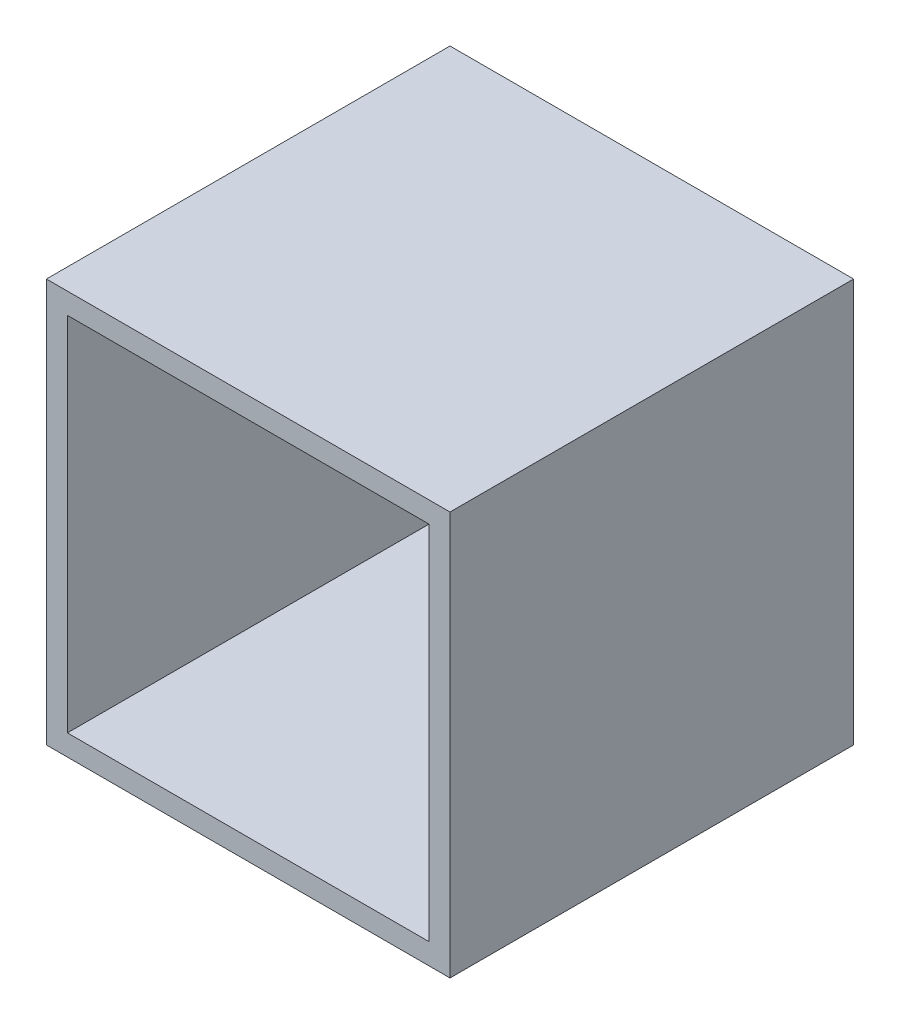
ISO-10303-21;
HEADER;
FILE_DESCRIPTION(('STEP AP214'),'2;1');
FILE_NAME('part.step','',(''),(''),'','','');
FILE_SCHEMA(('AUTOMOTIVE_DESIGN { 1 0 10303 214 1 1 1 1 }'));
ENDSEC;
DATA;
#1=APPLICATION_CONTEXT('core data for automotive mechanical design processes');
#2=APPLICATION_PROTOCOL_DEFINITION('international standard','automotive_design',2000,#1);
#3=PRODUCT_CONTEXT('',#1,'mechanical');
#4=PRODUCT('Part','Part','',(#3));
#5=PRODUCT_RELATED_PRODUCT_CATEGORY('part','',(#4));
#6=PRODUCT_DEFINITION_FORMATION('','',#4);
#7=PRODUCT_DEFINITION_CONTEXT('part definition',#1,'design');
#8=PRODUCT_DEFINITION('design','',#6,#7);
#9=PRODUCT_DEFINITION_SHAPE('','',#8);
#10=(LENGTH_UNIT() NAMED_UNIT(*) SI_UNIT(.MILLI.,.METRE.));
#11=(NAMED_UNIT(*) PLANE_ANGLE_UNIT() SI_UNIT($,.RADIAN.));
#12=(NAMED_UNIT(*) SI_UNIT($,.STERADIAN.) SOLID_ANGLE_UNIT());
#13=UNCERTAINTY_MEASURE_WITH_UNIT(LENGTH_MEASURE(1.E-05),#10,'distance_accuracy_value','');
#14=(GEOMETRIC_REPRESENTATION_CONTEXT(3) GLOBAL_UNCERTAINTY_ASSIGNED_CONTEXT((#13)) GLOBAL_UNIT_ASSIGNED_CONTEXT((#10,
#11,#12)) REPRESENTATION_CONTEXT('',''));
#15=CARTESIAN_POINT('',(0.,0.,0.));
#16=DIRECTION('',(0.,0.,1.));
#17=DIRECTION('',(1.,0.,0.));
#18=AXIS2_PLACEMENT_3D('',#15,#16,#17);
#19=CARTESIAN_POINT('',(0.,0.,63.5));
#20=DIRECTION('',(0.,0.,-1.));
#21=DIRECTION('',(-1.,0.,0.));
#22=AXIS2_PLACEMENT_3D('',#19,#20,#21);
#23=PLANE('',#22);
#24=DIRECTION('',(0.,1.,0.));
#25=VECTOR('',#24,1.);
#26=CARTESIAN_POINT('',(31.75,-31.75,63.5));
#27=LINE('',#26,#25);
#28=CARTESIAN_POINT('',(31.75,-31.75,63.5));
#29=VERTEX_POINT('',#28);
#30=CARTESIAN_POINT('',(31.75,31.75,63.5));
#31=VERTEX_POINT('',#30);
#32=EDGE_CURVE('E168',#29,#31,#27,.T.);
#33=ORIENTED_EDGE('',*,*,#32,.T.);
#34=DIRECTION('',(-1.,0.,0.));
#35=VECTOR('',#34,1.);
#36=CARTESIAN_POINT('',(-31.75,31.75,63.5));
#37=LINE('',#36,#35);
#38=CARTESIAN_POINT('',(-31.75,31.75,63.5));
#39=VERTEX_POINT('',#38);
#40=EDGE_CURVE('E172',#31,#39,#37,.T.);
#41=ORIENTED_EDGE('',*,*,#40,.T.);
#42=DIRECTION('',(0.,-1.,0.));
#43=VECTOR('',#42,1.);
#44=CARTESIAN_POINT('',(-31.75,-31.75,63.5));
#45=LINE('',#44,#43);
#46=CARTESIAN_POINT('',(-31.75,-31.75,63.5));
#47=VERTEX_POINT('',#46);
#48=EDGE_CURVE('E176',#39,#47,#45,.T.);
#49=ORIENTED_EDGE('',*,*,#48,.T.);
#50=DIRECTION('',(1.,0.,0.));
#51=VECTOR('',#50,1.);
#52=CARTESIAN_POINT('',(-31.75,-31.75,63.5));
#53=LINE('',#52,#51);
#54=EDGE_CURVE('E179',#47,#29,#53,.T.);
#55=ORIENTED_EDGE('',*,*,#54,.T.);
#56=EDGE_LOOP('',(#33,#41,#49,#55));
#57=FACE_BOUND('',#56,.T.);
#58=DIRECTION('',(0.,1.,0.));
#59=VECTOR('',#58,1.);
#60=CARTESIAN_POINT('',(28.448,-28.448,63.5));
#61=LINE('',#60,#59);
#62=CARTESIAN_POINT('',(28.448,-28.448,63.5));
#63=VERTEX_POINT('',#62);
#64=CARTESIAN_POINT('',(28.448,28.448,63.5));
#65=VERTEX_POINT('',#64);
#66=EDGE_CURVE('E120',#63,#65,#61,.T.);
#67=ORIENTED_EDGE('',*,*,#66,.F.);
#68=DIRECTION('',(1.,0.,0.));
#69=VECTOR('',#68,1.);
#70=CARTESIAN_POINT('',(-28.448,-28.448,63.5));
#71=LINE('',#70,#69);
#72=CARTESIAN_POINT('',(-28.448,-28.448,63.5));
#73=VERTEX_POINT('',#72);
#74=EDGE_CURVE('E146',#73,#63,#71,.T.);
#75=ORIENTED_EDGE('',*,*,#74,.F.);
#76=DIRECTION('',(0.,-1.,0.));
#77=VECTOR('',#76,1.);
#78=CARTESIAN_POINT('',(-28.448,-28.448,63.5));
#79=LINE('',#78,#77);
#80=CARTESIAN_POINT('',(-28.448,28.448,63.5));
#81=VERTEX_POINT('',#80);
#82=EDGE_CURVE('E142',#81,#73,#79,.T.);
#83=ORIENTED_EDGE('',*,*,#82,.F.);
#84=DIRECTION('',(-1.,0.,0.));
#85=VECTOR('',#84,1.);
#86=CARTESIAN_POINT('',(-28.448,28.448,63.5));
#87=LINE('',#86,#85);
#88=EDGE_CURVE('E129',#65,#81,#87,.T.);
#89=ORIENTED_EDGE('',*,*,#88,.F.);
#90=EDGE_LOOP('',(#67,#75,#83,#89));
#91=FACE_BOUND('',#90,.T.);
#92=ADVANCED_FACE('F54',(#57,#91),#23,.F.);
#93=CARTESIAN_POINT('',(0.,0.,0.));
#94=DIRECTION('',(0.,0.,-1.));
#95=DIRECTION('',(-1.,0.,0.));
#96=AXIS2_PLACEMENT_3D('',#93,#94,#95);
#97=PLANE('',#96);
#98=DIRECTION('',(0.,1.,0.));
#99=VECTOR('',#98,1.);
#100=CARTESIAN_POINT('',(31.75,-31.75,0.));
#101=LINE('',#100,#99);
#102=CARTESIAN_POINT('',(31.75,-31.75,0.));
#103=VERTEX_POINT('',#102);
#104=CARTESIAN_POINT('',(31.75,31.75,0.));
#105=VERTEX_POINT('',#104);
#106=EDGE_CURVE('E138',#103,#105,#101,.T.);
#107=ORIENTED_EDGE('',*,*,#106,.F.);
#108=DIRECTION('',(1.,0.,0.));
#109=VECTOR('',#108,1.);
#110=CARTESIAN_POINT('',(-31.75,-31.75,0.));
#111=LINE('',#110,#109);
#112=CARTESIAN_POINT('',(-31.75,-31.75,0.));
#113=VERTEX_POINT('',#112);
#114=EDGE_CURVE('E173',#113,#103,#111,.T.);
#115=ORIENTED_EDGE('',*,*,#114,.F.);
#116=DIRECTION('',(0.,-1.,0.));
#117=VECTOR('',#116,1.);
#118=CARTESIAN_POINT('',(-31.75,-31.75,0.));
#119=LINE('',#118,#117);
#120=CARTESIAN_POINT('',(-31.75,31.75,0.));
#121=VERTEX_POINT('',#120);
#122=EDGE_CURVE('E189',#121,#113,#119,.T.);
#123=ORIENTED_EDGE('',*,*,#122,.F.);
#124=DIRECTION('',(-1.,0.,0.));
#125=VECTOR('',#124,1.);
#126=CARTESIAN_POINT('',(-31.75,31.75,0.));
#127=LINE('',#126,#125);
#128=EDGE_CURVE('E186',#105,#121,#127,.T.);
#129=ORIENTED_EDGE('',*,*,#128,.F.);
#130=EDGE_LOOP('',(#107,#115,#123,#129));
#131=FACE_BOUND('',#130,.T.);
#132=DIRECTION('',(1.,0.,0.));
#133=VECTOR('',#132,1.);
#134=CARTESIAN_POINT('',(-28.448,-28.448,0.));
#135=LINE('',#134,#133);
#136=CARTESIAN_POINT('',(-28.448,-28.448,0.));
#137=VERTEX_POINT('',#136);
#138=CARTESIAN_POINT('',(28.448,-28.448,0.));
#139=VERTEX_POINT('',#138);
#140=EDGE_CURVE('E130',#137,#139,#135,.T.);
#141=ORIENTED_EDGE('',*,*,#140,.T.);
#142=DIRECTION('',(0.,1.,0.));
#143=VECTOR('',#142,1.);
#144=CARTESIAN_POINT('',(28.448,-28.448,0.));
#145=LINE('',#144,#143);
#146=CARTESIAN_POINT('',(28.448,28.448,0.));
#147=VERTEX_POINT('',#146);
#148=EDGE_CURVE('E78',#139,#147,#145,.T.);
#149=ORIENTED_EDGE('',*,*,#148,.T.);
#150=DIRECTION('',(-1.,0.,0.));
#151=VECTOR('',#150,1.);
#152=CARTESIAN_POINT('',(-28.448,28.448,0.));
#153=LINE('',#152,#151);
#154=CARTESIAN_POINT('',(-28.448,28.448,0.));
#155=VERTEX_POINT('',#154);
#156=EDGE_CURVE('E136',#147,#155,#153,.T.);
#157=ORIENTED_EDGE('',*,*,#156,.T.);
#158=DIRECTION('',(0.,-1.,0.));
#159=VECTOR('',#158,1.);
#160=CARTESIAN_POINT('',(-28.448,-28.448,0.));
#161=LINE('',#160,#159);
#162=EDGE_CURVE('E155',#155,#137,#161,.T.);
#163=ORIENTED_EDGE('',*,*,#162,.T.);
#164=EDGE_LOOP('',(#141,#149,#157,#163));
#165=FACE_BOUND('',#164,.T.);
#166=ADVANCED_FACE('F212',(#131,#165),#97,.T.);
#167=CARTESIAN_POINT('',(31.75,-31.75,63.5));
#168=DIRECTION('',(-1.,0.,0.));
#169=DIRECTION('',(0.,0.,1.));
#170=AXIS2_PLACEMENT_3D('',#167,#168,#169);
#171=PLANE('',#170);
#172=ORIENTED_EDGE('',*,*,#106,.T.);
#173=DIRECTION('',(0.,0.,-1.));
#174=VECTOR('',#173,1.);
#175=CARTESIAN_POINT('',(31.75,31.75,63.5));
#176=LINE('',#175,#174);
#177=EDGE_CURVE('E12',#31,#105,#176,.T.);
#178=ORIENTED_EDGE('',*,*,#177,.F.);
#179=ORIENTED_EDGE('',*,*,#32,.F.);
#180=DIRECTION('',(0.,0.,-1.));
#181=VECTOR('',#180,1.);
#182=CARTESIAN_POINT('',(31.75,-31.75,63.5));
#183=LINE('',#182,#181);
#184=EDGE_CURVE('E182',#29,#103,#183,.T.);
#185=ORIENTED_EDGE('',*,*,#184,.T.);
#186=EDGE_LOOP('',(#172,#178,#179,#185));
#187=FACE_BOUND('',#186,.T.);
#188=ADVANCED_FACE('F56',(#187),#171,.F.);
#189=CARTESIAN_POINT('',(-31.75,31.75,63.5));
#190=DIRECTION('',(0.,-1.,0.));
#191=DIRECTION('',(0.,0.,-1.));
#192=AXIS2_PLACEMENT_3D('',#189,#190,#191);
#193=PLANE('',#192);
#194=ORIENTED_EDGE('',*,*,#128,.T.);
#195=DIRECTION('',(0.,0.,-1.));
#196=VECTOR('',#195,1.);
#197=CARTESIAN_POINT('',(-31.75,31.75,63.5));
#198=LINE('',#197,#196);
#199=EDGE_CURVE('E63',#39,#121,#198,.T.);
#200=ORIENTED_EDGE('',*,*,#199,.F.);
#201=ORIENTED_EDGE('',*,*,#40,.F.);
#202=ORIENTED_EDGE('',*,*,#177,.T.);
#203=EDGE_LOOP('',(#194,#200,#201,#202));
#204=FACE_BOUND('',#203,.T.);
#205=ADVANCED_FACE('F222',(#204),#193,.F.);
#206=CARTESIAN_POINT('',(-31.75,-31.75,63.5));
#207=DIRECTION('',(1.,0.,0.));
#208=DIRECTION('',(0.,0.,-1.));
#209=AXIS2_PLACEMENT_3D('',#206,#207,#208);
#210=PLANE('',#209);
#211=ORIENTED_EDGE('',*,*,#122,.T.);
#212=DIRECTION('',(0.,0.,-1.));
#213=VECTOR('',#212,1.);
#214=CARTESIAN_POINT('',(-31.75,-31.75,63.5));
#215=LINE('',#214,#213);
#216=EDGE_CURVE('E197',#47,#113,#215,.T.);
#217=ORIENTED_EDGE('',*,*,#216,.F.);
#218=ORIENTED_EDGE('',*,*,#48,.F.);
#219=ORIENTED_EDGE('',*,*,#199,.T.);
#220=EDGE_LOOP('',(#211,#217,#218,#219));
#221=FACE_BOUND('',#220,.T.);
#222=ADVANCED_FACE('F206',(#221),#210,.F.);
#223=CARTESIAN_POINT('',(-31.75,-31.75,63.5));
#224=DIRECTION('',(0.,1.,0.));
#225=DIRECTION('',(0.,0.,1.));
#226=AXIS2_PLACEMENT_3D('',#223,#224,#225);
#227=PLANE('',#226);
#228=ORIENTED_EDGE('',*,*,#114,.T.);
#229=ORIENTED_EDGE('',*,*,#184,.F.);
#230=ORIENTED_EDGE('',*,*,#54,.F.);
#231=ORIENTED_EDGE('',*,*,#216,.T.);
#232=EDGE_LOOP('',(#228,#229,#230,#231));
#233=FACE_BOUND('',#232,.T.);
#234=ADVANCED_FACE('F216',(#233),#227,.F.);
#235=CARTESIAN_POINT('',(28.448,-28.448,63.5));
#236=DIRECTION('',(-1.,0.,0.));
#237=DIRECTION('',(0.,0.,1.));
#238=AXIS2_PLACEMENT_3D('',#235,#236,#237);
#239=PLANE('',#238);
#240=ORIENTED_EDGE('',*,*,#148,.F.);
#241=DIRECTION('',(0.,0.,-1.));
#242=VECTOR('',#241,1.);
#243=CARTESIAN_POINT('',(28.448,-28.448,63.5));
#244=LINE('',#243,#242);
#245=EDGE_CURVE('E124',#63,#139,#244,.T.);
#246=ORIENTED_EDGE('',*,*,#245,.F.);
#247=ORIENTED_EDGE('',*,*,#66,.T.);
#248=DIRECTION('',(0.,0.,-1.));
#249=VECTOR('',#248,1.);
#250=CARTESIAN_POINT('',(28.448,28.448,63.5));
#251=LINE('',#250,#249);
#252=EDGE_CURVE('E123',#65,#147,#251,.T.);
#253=ORIENTED_EDGE('',*,*,#252,.T.);
#254=EDGE_LOOP('',(#240,#246,#247,#253));
#255=FACE_BOUND('',#254,.T.);
#256=ADVANCED_FACE('F122',(#255),#239,.T.);
#257=CARTESIAN_POINT('',(-28.448,28.448,63.5));
#258=DIRECTION('',(0.,-1.,0.));
#259=DIRECTION('',(0.,0.,-1.));
#260=AXIS2_PLACEMENT_3D('',#257,#258,#259);
#261=PLANE('',#260);
#262=ORIENTED_EDGE('',*,*,#156,.F.);
#263=ORIENTED_EDGE('',*,*,#252,.F.);
#264=ORIENTED_EDGE('',*,*,#88,.T.);
#265=DIRECTION('',(0.,0.,-1.));
#266=VECTOR('',#265,1.);
#267=CARTESIAN_POINT('',(-28.448,28.448,63.5));
#268=LINE('',#267,#266);
#269=EDGE_CURVE('E139',#81,#155,#268,.T.);
#270=ORIENTED_EDGE('',*,*,#269,.T.);
#271=EDGE_LOOP('',(#262,#263,#264,#270));
#272=FACE_BOUND('',#271,.T.);
#273=ADVANCED_FACE('F133',(#272),#261,.T.);
#274=CARTESIAN_POINT('',(-28.448,-28.448,63.5));
#275=DIRECTION('',(1.,0.,0.));
#276=DIRECTION('',(0.,0.,-1.));
#277=AXIS2_PLACEMENT_3D('',#274,#275,#276);
#278=PLANE('',#277);
#279=ORIENTED_EDGE('',*,*,#162,.F.);
#280=ORIENTED_EDGE('',*,*,#269,.F.);
#281=ORIENTED_EDGE('',*,*,#82,.T.);
#282=DIRECTION('',(0.,0.,-1.));
#283=VECTOR('',#282,1.);
#284=CARTESIAN_POINT('',(-28.448,-28.448,63.5));
#285=LINE('',#284,#283);
#286=EDGE_CURVE('E70',#73,#137,#285,.T.);
#287=ORIENTED_EDGE('',*,*,#286,.T.);
#288=EDGE_LOOP('',(#279,#280,#281,#287));
#289=FACE_BOUND('',#288,.T.);
#290=ADVANCED_FACE('F245',(#289),#278,.T.);
#291=CARTESIAN_POINT('',(-28.448,-28.448,63.5));
#292=DIRECTION('',(0.,1.,0.));
#293=DIRECTION('',(0.,0.,1.));
#294=AXIS2_PLACEMENT_3D('',#291,#292,#293);
#295=PLANE('',#294);
#296=ORIENTED_EDGE('',*,*,#140,.F.);
#297=ORIENTED_EDGE('',*,*,#286,.F.);
#298=ORIENTED_EDGE('',*,*,#74,.T.);
#299=ORIENTED_EDGE('',*,*,#245,.T.);
#300=EDGE_LOOP('',(#296,#297,#298,#299));
#301=FACE_BOUND('',#300,.T.);
#302=ADVANCED_FACE('F249',(#301),#295,.T.);
#303=CLOSED_SHELL('',(#92,#166,#188,#205,#222,#234,#256,#273,#290,#302));
#304=MANIFOLD_SOLID_BREP('B2',#303);
#305=CARTESIAN_POINT('',(0.,0.,0.));
#306=DIRECTION('',(0.,0.,-1.));
#307=DIRECTION('',(-1.,0.,0.));
#308=AXIS2_PLACEMENT_3D('',#305,#306,#307);
#309=PLANE('',#308);
#310=DIRECTION('',(0.,1.,0.));
#311=VECTOR('',#310,1.);
#312=CARTESIAN_POINT('',(31.75,-31.75,0.));
#313=LINE('',#312,#311);
#314=CARTESIAN_POINT('',(31.75,-31.75,0.));
#315=VERTEX_POINT('',#314);
#316=CARTESIAN_POINT('',(31.75,31.75,0.));
#317=VERTEX_POINT('',#316);
#318=EDGE_CURVE('E360',#315,#317,#313,.T.);
#319=ORIENTED_EDGE('',*,*,#318,.T.);
#320=DIRECTION('',(-1.,0.,0.));
#321=VECTOR('',#320,1.);
#322=CARTESIAN_POINT('',(-31.75,31.75,0.));
#323=LINE('',#322,#321);
#324=CARTESIAN_POINT('',(-31.75,31.75,0.));
#325=VERTEX_POINT('',#324);
#326=EDGE_CURVE('E362',#317,#325,#323,.T.);
#327=ORIENTED_EDGE('',*,*,#326,.T.);
#328=DIRECTION('',(0.,-1.,0.));
#329=VECTOR('',#328,1.);
#330=CARTESIAN_POINT('',(-31.75,-31.75,0.));
#331=LINE('',#330,#329);
#332=CARTESIAN_POINT('',(-31.75,-31.75,0.));
#333=VERTEX_POINT('',#332);
#334=EDGE_CURVE('E369',#325,#333,#331,.T.);
#335=ORIENTED_EDGE('',*,*,#334,.T.);
#336=DIRECTION('',(1.,0.,0.));
#337=VECTOR('',#336,1.);
#338=CARTESIAN_POINT('',(-31.75,-31.75,0.));
#339=LINE('',#338,#337);
#340=EDGE_CURVE('E365',#333,#315,#339,.T.);
#341=ORIENTED_EDGE('',*,*,#340,.T.);
#342=EDGE_LOOP('',(#319,#327,#335,#341));
#343=FACE_BOUND('',#342,.T.);
#344=DIRECTION('',(0.,1.,0.));
#345=VECTOR('',#344,1.);
#346=CARTESIAN_POINT('',(28.448,-28.448,0.));
#347=LINE('',#346,#345);
#348=CARTESIAN_POINT('',(28.448,-28.448,0.));
#349=VERTEX_POINT('',#348);
#350=CARTESIAN_POINT('',(28.448,28.448,0.));
#351=VERTEX_POINT('',#350);
#352=EDGE_CURVE('E336',#349,#351,#347,.T.);
#353=ORIENTED_EDGE('',*,*,#352,.F.);
#354=DIRECTION('',(1.,0.,0.));
#355=VECTOR('',#354,1.);
#356=CARTESIAN_POINT('',(-28.448,-28.448,0.));
#357=LINE('',#356,#355);
#358=CARTESIAN_POINT('',(-28.448,-28.448,0.));
#359=VERTEX_POINT('',#358);
#360=EDGE_CURVE('E380',#359,#349,#357,.T.);
#361=ORIENTED_EDGE('',*,*,#360,.F.);
#362=DIRECTION('',(0.,-1.,0.));
#363=VECTOR('',#362,1.);
#364=CARTESIAN_POINT('',(-28.448,-28.448,0.));
#365=LINE('',#364,#363);
#366=CARTESIAN_POINT('',(-28.448,28.448,0.));
#367=VERTEX_POINT('',#366);
#368=EDGE_CURVE('E332',#367,#359,#365,.T.);
#369=ORIENTED_EDGE('',*,*,#368,.F.);
#370=DIRECTION('',(-1.,0.,0.));
#371=VECTOR('',#370,1.);
#372=CARTESIAN_POINT('',(-28.448,28.448,0.));
#373=LINE('',#372,#371);
#374=EDGE_CURVE('E52',#351,#367,#373,.T.);
#375=ORIENTED_EDGE('',*,*,#374,.F.);
#376=EDGE_LOOP('',(#353,#361,#369,#375));
#377=FACE_BOUND('',#376,.T.);
#378=ADVANCED_FACE('F327',(#343,#377),#309,.F.);
#379=OPEN_SHELL('',(#378));
#380=SHELL_BASED_SURFACE_MODEL('B6',(#379));
#381=ADVANCED_BREP_SHAPE_REPRESENTATION('',(#18,#304),#14);
#382=MANIFOLD_SURFACE_SHAPE_REPRESENTATION('',(#18,#380),#14);
#383=SHAPE_REPRESENTATION('',(#18),#14);
#384=SHAPE_DEFINITION_REPRESENTATION(#9,#383);
#385=SHAPE_REPRESENTATION_RELATIONSHIP('','',#383,#381);
#386=SHAPE_REPRESENTATION_RELATIONSHIP('','',#383,#382);
ENDSEC;
END-ISO-10303-21;
